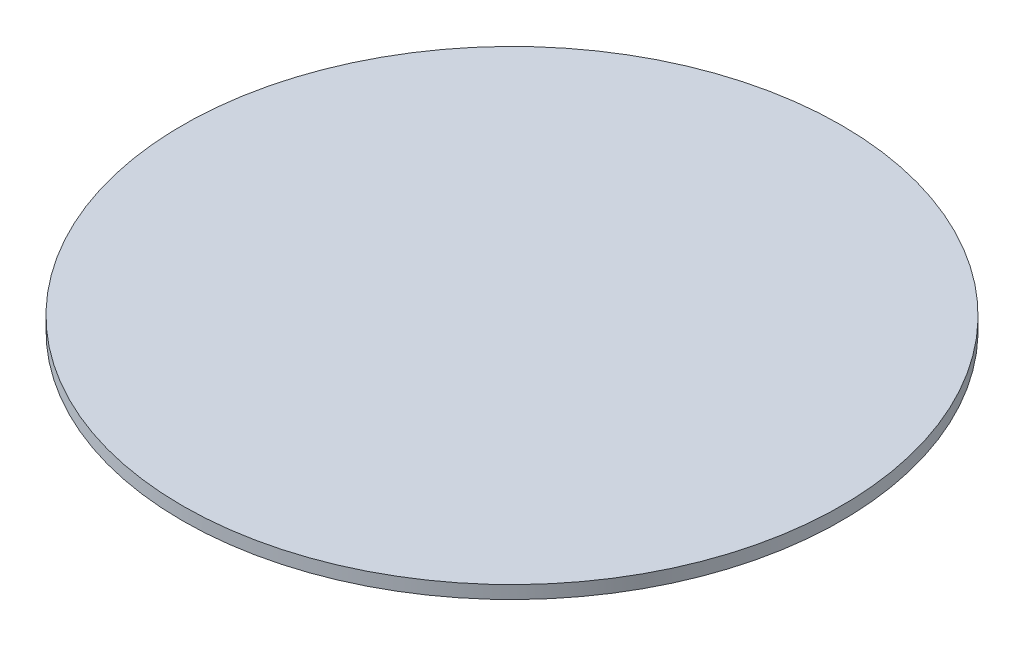
ISO-10303-21;
HEADER;
FILE_DESCRIPTION(('STEP AP214'),'2;1');
FILE_NAME('part.step','',(''),(''),'','','');
FILE_SCHEMA(('AUTOMOTIVE_DESIGN { 1 0 10303 214 1 1 1 1 }'));
ENDSEC;
DATA;
#1=APPLICATION_CONTEXT('core data for automotive mechanical design processes');
#2=APPLICATION_PROTOCOL_DEFINITION('international standard','automotive_design',2000,#1);
#3=PRODUCT_CONTEXT('',#1,'mechanical');
#4=PRODUCT('Part','Part','',(#3));
#5=PRODUCT_RELATED_PRODUCT_CATEGORY('part','',(#4));
#6=PRODUCT_DEFINITION_FORMATION('','',#4);
#7=PRODUCT_DEFINITION_CONTEXT('part definition',#1,'design');
#8=PRODUCT_DEFINITION('design','',#6,#7);
#9=PRODUCT_DEFINITION_SHAPE('','',#8);
#10=(LENGTH_UNIT() NAMED_UNIT(*) SI_UNIT(.MILLI.,.METRE.));
#11=(NAMED_UNIT(*) PLANE_ANGLE_UNIT() SI_UNIT($,.RADIAN.));
#12=(NAMED_UNIT(*) SI_UNIT($,.STERADIAN.) SOLID_ANGLE_UNIT());
#13=UNCERTAINTY_MEASURE_WITH_UNIT(LENGTH_MEASURE(1.E-05),#10,'distance_accuracy_value','');
#14=(GEOMETRIC_REPRESENTATION_CONTEXT(3) GLOBAL_UNCERTAINTY_ASSIGNED_CONTEXT((#13)) GLOBAL_UNIT_ASSIGNED_CONTEXT((#10,
#11,#12)) REPRESENTATION_CONTEXT('',''));
#15=CARTESIAN_POINT('',(0.,0.,0.));
#16=DIRECTION('',(0.,0.,1.));
#17=DIRECTION('',(1.,0.,0.));
#18=AXIS2_PLACEMENT_3D('',#15,#16,#17);
#19=CARTESIAN_POINT('',(0.,0.5,0.));
#20=DIRECTION('',(0.,-1.,0.));
#21=DIRECTION('',(0.,0.,-1.));
#22=AXIS2_PLACEMENT_3D('',#19,#20,#21);
#23=CYLINDRICAL_SURFACE('',#22,12.7);
#24=CARTESIAN_POINT('',(0.,0.5,0.));
#25=DIRECTION('',(0.,1.,0.));
#26=DIRECTION('',(0.,0.,1.));
#27=AXIS2_PLACEMENT_3D('',#24,#25,#26);
#28=CIRCLE('',#27,12.7);
#29=CARTESIAN_POINT('',(0.,0.5,12.7));
#30=VERTEX_POINT('',#29);
#31=EDGE_CURVE('E10',#30,#30,#28,.T.);
#32=ORIENTED_EDGE('',*,*,#31,.F.);
#33=EDGE_LOOP('',(#32));
#34=FACE_BOUND('',#33,.T.);
#35=CARTESIAN_POINT('',(0.,0.,0.));
#36=DIRECTION('',(0.,1.,0.));
#37=DIRECTION('',(0.,0.,1.));
#38=AXIS2_PLACEMENT_3D('',#35,#36,#37);
#39=CIRCLE('',#38,12.7);
#40=CARTESIAN_POINT('',(0.,0.,12.7));
#41=VERTEX_POINT('',#40);
#42=EDGE_CURVE('E40',#41,#41,#39,.T.);
#43=ORIENTED_EDGE('',*,*,#42,.T.);
#44=EDGE_LOOP('',(#43));
#45=FACE_BOUND('',#44,.T.);
#46=ADVANCED_FACE('F37',(#34,#45),#23,.T.);
#47=CARTESIAN_POINT('',(0.,0.5,0.));
#48=DIRECTION('',(0.,1.,0.));
#49=DIRECTION('',(0.,0.,1.));
#50=AXIS2_PLACEMENT_3D('',#47,#48,#49);
#51=PLANE('',#50);
#52=ORIENTED_EDGE('',*,*,#31,.T.);
#53=EDGE_LOOP('',(#52));
#54=FACE_BOUND('',#53,.T.);
#55=ADVANCED_FACE('F54',(#54),#51,.T.);
#56=CARTESIAN_POINT('',(0.,0.,0.));
#57=DIRECTION('',(0.,1.,0.));
#58=DIRECTION('',(0.,0.,1.));
#59=AXIS2_PLACEMENT_3D('',#56,#57,#58);
#60=PLANE('',#59);
#61=ORIENTED_EDGE('',*,*,#42,.F.);
#62=EDGE_LOOP('',(#61));
#63=FACE_BOUND('',#62,.T.);
#64=ADVANCED_FACE('F52',(#63),#60,.F.);
#65=CLOSED_SHELL('',(#46,#55,#64));
#66=MANIFOLD_SOLID_BREP('B2',#65);
#67=ADVANCED_BREP_SHAPE_REPRESENTATION('',(#18,#66),#14);
#68=SHAPE_DEFINITION_REPRESENTATION(#9,#67);
ENDSEC;
END-ISO-10303-21;
